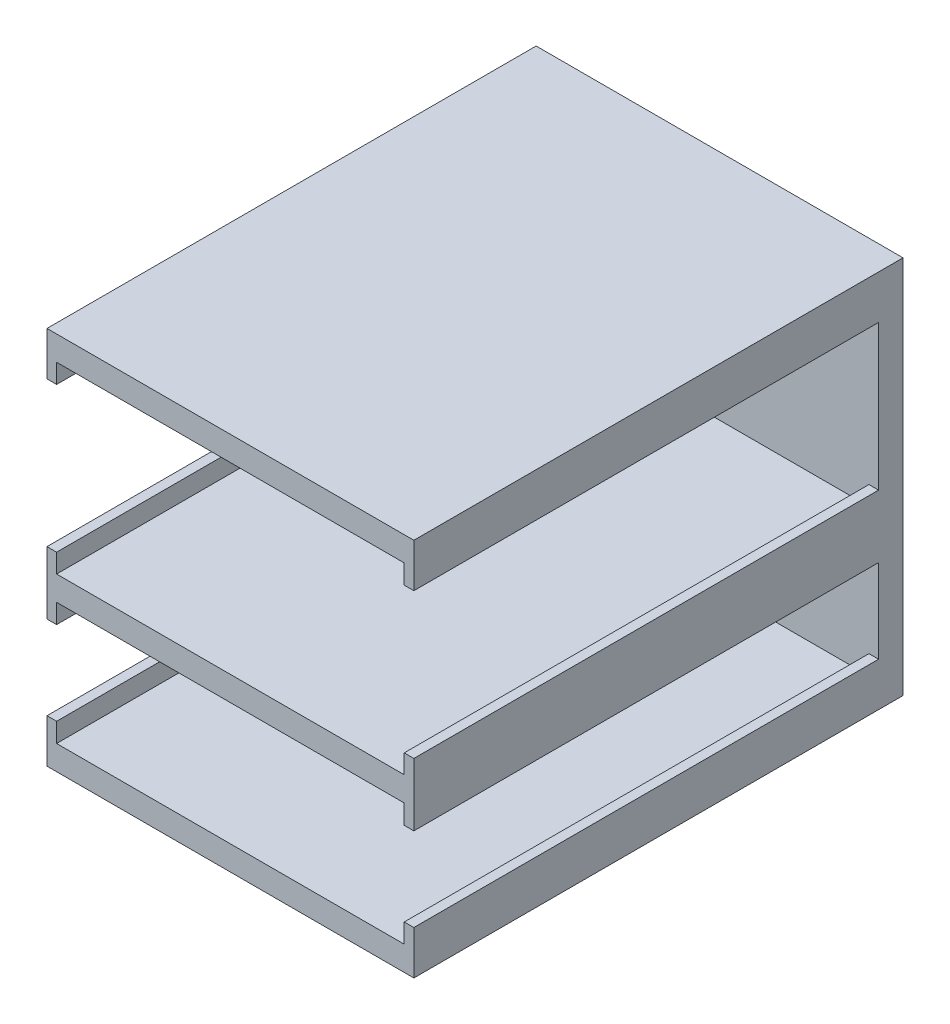
ISO-10303-21;
HEADER;
FILE_DESCRIPTION(('STEP AP214'),'2;1');
FILE_NAME('part.step','',(''),(''),'','','');
FILE_SCHEMA(('AUTOMOTIVE_DESIGN { 1 0 10303 214 1 1 1 1 }'));
ENDSEC;
DATA;
#1=APPLICATION_CONTEXT('core data for automotive mechanical design processes');
#2=APPLICATION_PROTOCOL_DEFINITION('international standard','automotive_design',2000,#1);
#3=PRODUCT_CONTEXT('',#1,'mechanical');
#4=PRODUCT('Part','Part','',(#3));
#5=PRODUCT_RELATED_PRODUCT_CATEGORY('part','',(#4));
#6=PRODUCT_DEFINITION_FORMATION('','',#4);
#7=PRODUCT_DEFINITION_CONTEXT('part definition',#1,'design');
#8=PRODUCT_DEFINITION('design','',#6,#7);
#9=PRODUCT_DEFINITION_SHAPE('','',#8);
#10=(LENGTH_UNIT() NAMED_UNIT(*) SI_UNIT(.MILLI.,.METRE.));
#11=(NAMED_UNIT(*) PLANE_ANGLE_UNIT() SI_UNIT($,.RADIAN.));
#12=(NAMED_UNIT(*) SI_UNIT($,.STERADIAN.) SOLID_ANGLE_UNIT());
#13=UNCERTAINTY_MEASURE_WITH_UNIT(LENGTH_MEASURE(1.E-05),#10,'distance_accuracy_value','');
#14=(GEOMETRIC_REPRESENTATION_CONTEXT(3) GLOBAL_UNCERTAINTY_ASSIGNED_CONTEXT((#13)) GLOBAL_UNIT_ASSIGNED_CONTEXT((#10,
#11,#12)) REPRESENTATION_CONTEXT('',''));
#15=CARTESIAN_POINT('',(0.,0.,0.));
#16=DIRECTION('',(0.,0.,1.));
#17=DIRECTION('',(1.,0.,0.));
#18=AXIS2_PLACEMENT_3D('',#15,#16,#17);
#19=CARTESIAN_POINT('',(38.1,78.74,50.8));
#20=DIRECTION('',(0.,0.,-1.));
#21=DIRECTION('',(-1.,0.,0.));
#22=AXIS2_PLACEMENT_3D('',#19,#20,#21);
#23=PLANE('',#22);
#24=DIRECTION('',(1.,0.,0.));
#25=VECTOR('',#24,1.);
#26=CARTESIAN_POINT('',(34.1,69.66,50.8));
#27=LINE('',#26,#25);
#28=CARTESIAN_POINT('',(36.1,69.66,50.8));
#29=VERTEX_POINT('',#28);
#30=CARTESIAN_POINT('',(38.1,69.66,50.8));
#31=VERTEX_POINT('',#30);
#32=EDGE_CURVE('E374',#29,#31,#27,.T.);
#33=ORIENTED_EDGE('',*,*,#32,.T.);
#34=DIRECTION('',(0.,-1.,0.));
#35=VECTOR('',#34,1.);
#36=CARTESIAN_POINT('',(38.1,78.74,50.8));
#37=LINE('',#36,#35);
#38=CARTESIAN_POINT('',(38.1,78.74,50.8));
#39=VERTEX_POINT('',#38);
#40=EDGE_CURVE('E257',#39,#31,#37,.T.);
#41=ORIENTED_EDGE('',*,*,#40,.F.);
#42=DIRECTION('',(1.,0.,0.));
#43=VECTOR('',#42,1.);
#44=CARTESIAN_POINT('',(38.1,78.74,50.8));
#45=LINE('',#44,#43);
#46=CARTESIAN_POINT('',(-38.1,78.74,50.8));
#47=VERTEX_POINT('',#46);
#48=EDGE_CURVE('E392',#47,#39,#45,.T.);
#49=ORIENTED_EDGE('',*,*,#48,.F.);
#50=DIRECTION('',(0.,-1.,0.));
#51=VECTOR('',#50,1.);
#52=CARTESIAN_POINT('',(-38.1,78.74,50.8));
#53=LINE('',#52,#51);
#54=CARTESIAN_POINT('',(-38.1,69.66,50.8));
#55=VERTEX_POINT('',#54);
#56=EDGE_CURVE('E268',#47,#55,#53,.T.);
#57=ORIENTED_EDGE('',*,*,#56,.T.);
#58=DIRECTION('',(-1.,0.,0.));
#59=VECTOR('',#58,1.);
#60=CARTESIAN_POINT('',(-34.1,69.66,50.8));
#61=LINE('',#60,#59);
#62=CARTESIAN_POINT('',(-36.1,69.66,50.8));
#63=VERTEX_POINT('',#62);
#64=EDGE_CURVE('E473',#63,#55,#61,.T.);
#65=ORIENTED_EDGE('',*,*,#64,.F.);
#66=DIRECTION('',(0.,-1.,0.));
#67=VECTOR('',#66,1.);
#68=CARTESIAN_POINT('',(-36.1,78.74,50.8));
#69=LINE('',#68,#67);
#70=CARTESIAN_POINT('',(-36.1,73.66,50.8));
#71=VERTEX_POINT('',#70);
#72=EDGE_CURVE('E500',#71,#63,#69,.T.);
#73=ORIENTED_EDGE('',*,*,#72,.F.);
#74=DIRECTION('',(-1.,0.,0.));
#75=VECTOR('',#74,1.);
#76=CARTESIAN_POINT('',(-38.1,73.66,50.8));
#77=LINE('',#76,#75);
#78=CARTESIAN_POINT('',(36.1,73.66,50.8));
#79=VERTEX_POINT('',#78);
#80=EDGE_CURVE('E517',#79,#71,#77,.T.);
#81=ORIENTED_EDGE('',*,*,#80,.F.);
#82=DIRECTION('',(0.,-1.,0.));
#83=VECTOR('',#82,1.);
#84=CARTESIAN_POINT('',(36.1,78.74,50.8));
#85=LINE('',#84,#83);
#86=EDGE_CURVE('E326',#79,#29,#85,.T.);
#87=ORIENTED_EDGE('',*,*,#86,.T.);
#88=EDGE_LOOP('',(#33,#41,#49,#57,#65,#73,#81,#87));
#89=FACE_BOUND('',#88,.T.);
#90=ADVANCED_FACE('F47',(#89),#23,.F.);
#91=DIRECTION('',(1.,0.,0.));
#92=VECTOR('',#91,1.);
#93=CARTESIAN_POINT('',(34.1,39.4956929003993,50.8));
#94=LINE('',#93,#92);
#95=CARTESIAN_POINT('',(36.1,39.4956929003993,50.8));
#96=VERTEX_POINT('',#95);
#97=CARTESIAN_POINT('',(38.1,39.4956929003993,50.8));
#98=VERTEX_POINT('',#97);
#99=EDGE_CURVE('E231',#96,#98,#94,.T.);
#100=ORIENTED_EDGE('',*,*,#99,.F.);
#101=CARTESIAN_POINT('',(36.1,35.56,50.8));
#102=VERTEX_POINT('',#101);
#103=EDGE_CURVE('E307',#96,#102,#85,.T.);
#104=ORIENTED_EDGE('',*,*,#103,.T.);
#105=DIRECTION('',(1.,0.,0.));
#106=VECTOR('',#105,1.);
#107=CARTESIAN_POINT('',(-38.1,35.56,50.8));
#108=LINE('',#107,#106);
#109=CARTESIAN_POINT('',(-36.1,35.56,50.8));
#110=VERTEX_POINT('',#109);
#111=EDGE_CURVE('E513',#110,#102,#108,.T.);
#112=ORIENTED_EDGE('',*,*,#111,.F.);
#113=CARTESIAN_POINT('',(-36.1,39.4956929003993,50.8));
#114=VERTEX_POINT('',#113);
#115=EDGE_CURVE('E499',#114,#110,#69,.T.);
#116=ORIENTED_EDGE('',*,*,#115,.F.);
#117=DIRECTION('',(-1.,0.,0.));
#118=VECTOR('',#117,1.);
#119=CARTESIAN_POINT('',(-34.1,39.4956929003993,50.8));
#120=LINE('',#119,#118);
#121=CARTESIAN_POINT('',(-38.1,39.4956929003993,50.8));
#122=VERTEX_POINT('',#121);
#123=EDGE_CURVE('E453',#114,#122,#120,.T.);
#124=ORIENTED_EDGE('',*,*,#123,.T.);
#125=CARTESIAN_POINT('',(-38.1,26.4594240145697,50.8));
#126=VERTEX_POINT('',#125);
#127=EDGE_CURVE('E273',#122,#126,#53,.T.);
#128=ORIENTED_EDGE('',*,*,#127,.T.);
#129=DIRECTION('',(-1.,0.,0.));
#130=VECTOR('',#129,1.);
#131=CARTESIAN_POINT('',(-34.1,26.4594240145697,50.8));
#132=LINE('',#131,#130);
#133=CARTESIAN_POINT('',(-36.1,26.4594240145697,50.8));
#134=VERTEX_POINT('',#133);
#135=EDGE_CURVE('E450',#134,#126,#132,.T.);
#136=ORIENTED_EDGE('',*,*,#135,.F.);
#137=CARTESIAN_POINT('',(-36.1,30.48,50.8));
#138=VERTEX_POINT('',#137);
#139=EDGE_CURVE('E496',#138,#134,#69,.T.);
#140=ORIENTED_EDGE('',*,*,#139,.F.);
#141=DIRECTION('',(-1.,0.,0.));
#142=VECTOR('',#141,1.);
#143=CARTESIAN_POINT('',(-38.1,30.48,50.8));
#144=LINE('',#143,#142);
#145=CARTESIAN_POINT('',(36.1,30.48,50.8));
#146=VERTEX_POINT('',#145);
#147=EDGE_CURVE('E529',#146,#138,#144,.T.);
#148=ORIENTED_EDGE('',*,*,#147,.F.);
#149=CARTESIAN_POINT('',(36.1,26.4594240145697,50.8));
#150=VERTEX_POINT('',#149);
#151=EDGE_CURVE('E333',#146,#150,#85,.T.);
#152=ORIENTED_EDGE('',*,*,#151,.T.);
#153=DIRECTION('',(1.,0.,0.));
#154=VECTOR('',#153,1.);
#155=CARTESIAN_POINT('',(34.1,26.4594240145697,50.8));
#156=LINE('',#155,#154);
#157=CARTESIAN_POINT('',(38.1,26.4594240145697,50.8));
#158=VERTEX_POINT('',#157);
#159=EDGE_CURVE('E255',#150,#158,#156,.T.);
#160=ORIENTED_EDGE('',*,*,#159,.T.);
#161=EDGE_CURVE('E246',#98,#158,#37,.T.);
#162=ORIENTED_EDGE('',*,*,#161,.F.);
#163=EDGE_LOOP('',(#100,#104,#112,#116,#124,#128,#136,#140,#148,#152,#160,#162));
#164=FACE_BOUND('',#163,.T.);
#165=ADVANCED_FACE('F253',(#164),#23,.F.);
#166=CARTESIAN_POINT('',(38.1,78.74,50.8));
#167=DIRECTION('',(-1.,0.,0.));
#168=DIRECTION('',(0.,0.,1.));
#169=AXIS2_PLACEMENT_3D('',#166,#167,#168);
#170=PLANE('',#169);
#171=DIRECTION('',(0.,0.,-1.));
#172=VECTOR('',#171,1.);
#173=CARTESIAN_POINT('',(38.1,69.66,-44.7633760845463));
#174=LINE('',#173,#172);
#175=CARTESIAN_POINT('',(38.1,69.66,-45.72));
#176=VERTEX_POINT('',#175);
#177=EDGE_CURVE('E240',#31,#176,#174,.T.);
#178=ORIENTED_EDGE('',*,*,#177,.T.);
#179=DIRECTION('',(0.,-1.,0.));
#180=VECTOR('',#179,1.);
#181=CARTESIAN_POINT('',(38.1,69.66,-45.72));
#182=LINE('',#181,#180);
#183=CARTESIAN_POINT('',(38.1,39.4956929003993,-45.72));
#184=VERTEX_POINT('',#183);
#185=EDGE_CURVE('E249',#176,#184,#182,.T.);
#186=ORIENTED_EDGE('',*,*,#185,.T.);
#187=DIRECTION('',(0.,0.,1.));
#188=VECTOR('',#187,1.);
#189=CARTESIAN_POINT('',(38.1,39.4956929003993,-45.72));
#190=LINE('',#189,#188);
#191=EDGE_CURVE('E234',#184,#98,#190,.T.);
#192=ORIENTED_EDGE('',*,*,#191,.T.);
#193=ORIENTED_EDGE('',*,*,#161,.T.);
#194=DIRECTION('',(0.,0.,-1.));
#195=VECTOR('',#194,1.);
#196=CARTESIAN_POINT('',(38.1,26.4594240145697,50.8));
#197=LINE('',#196,#195);
#198=CARTESIAN_POINT('',(38.1,26.4594240145697,-45.72));
#199=VERTEX_POINT('',#198);
#200=EDGE_CURVE('E360',#158,#199,#197,.T.);
#201=ORIENTED_EDGE('',*,*,#200,.T.);
#202=DIRECTION('',(0.,-1.,0.));
#203=VECTOR('',#202,1.);
#204=CARTESIAN_POINT('',(38.1,26.4594240145697,-45.72));
#205=LINE('',#204,#203);
#206=CARTESIAN_POINT('',(38.1,9.08,-45.72));
#207=VERTEX_POINT('',#206);
#208=EDGE_CURVE('E367',#199,#207,#205,.T.);
#209=ORIENTED_EDGE('',*,*,#208,.T.);
#210=DIRECTION('',(0.,0.,1.));
#211=VECTOR('',#210,1.);
#212=CARTESIAN_POINT('',(38.1,9.08,50.8));
#213=LINE('',#212,#211);
#214=CARTESIAN_POINT('',(38.1,9.08,50.8));
#215=VERTEX_POINT('',#214);
#216=EDGE_CURVE('E371',#207,#215,#213,.T.);
#217=ORIENTED_EDGE('',*,*,#216,.T.);
#218=CARTESIAN_POINT('',(38.1,0.,50.8));
#219=VERTEX_POINT('',#218);
#220=EDGE_CURVE('E258',#215,#219,#37,.T.);
#221=ORIENTED_EDGE('',*,*,#220,.T.);
#222=DIRECTION('',(0.,0.,-1.));
#223=VECTOR('',#222,1.);
#224=CARTESIAN_POINT('',(38.1,0.,50.8));
#225=LINE('',#224,#223);
#226=CARTESIAN_POINT('',(38.1,0.,-50.8));
#227=VERTEX_POINT('',#226);
#228=EDGE_CURVE('E419',#219,#227,#225,.T.);
#229=ORIENTED_EDGE('',*,*,#228,.T.);
#230=DIRECTION('',(0.,-1.,0.));
#231=VECTOR('',#230,1.);
#232=CARTESIAN_POINT('',(38.1,78.74,-50.8));
#233=LINE('',#232,#231);
#234=CARTESIAN_POINT('',(38.1,78.74,-50.8));
#235=VERTEX_POINT('',#234);
#236=EDGE_CURVE('E264',#235,#227,#233,.T.);
#237=ORIENTED_EDGE('',*,*,#236,.F.);
#238=DIRECTION('',(0.,0.,-1.));
#239=VECTOR('',#238,1.);
#240=CARTESIAN_POINT('',(38.1,78.74,50.8));
#241=LINE('',#240,#239);
#242=EDGE_CURVE('E395',#39,#235,#241,.T.);
#243=ORIENTED_EDGE('',*,*,#242,.F.);
#244=ORIENTED_EDGE('',*,*,#40,.T.);
#245=EDGE_LOOP('',(#178,#186,#192,#193,#201,#209,#217,#221,#229,#237,#243,#244));
#246=FACE_BOUND('',#245,.T.);
#247=ADVANCED_FACE('F244',(#246),#170,.F.);
#248=CARTESIAN_POINT('',(36.1,78.74,50.8));
#249=DIRECTION('',(-1.,0.,0.));
#250=DIRECTION('',(0.,0.,1.));
#251=AXIS2_PLACEMENT_3D('',#248,#249,#250);
#252=PLANE('',#251);
#253=DIRECTION('',(0.,-1.,0.));
#254=VECTOR('',#253,1.);
#255=CARTESIAN_POINT('',(36.1,78.74,-45.72));
#256=LINE('',#255,#254);
#257=CARTESIAN_POINT('',(36.1,73.66,-45.72));
#258=VERTEX_POINT('',#257);
#259=CARTESIAN_POINT('',(36.1,69.66,-45.72));
#260=VERTEX_POINT('',#259);
#261=EDGE_CURVE('E314',#258,#260,#256,.T.);
#262=ORIENTED_EDGE('',*,*,#261,.T.);
#263=DIRECTION('',(0.,0.,1.));
#264=VECTOR('',#263,1.);
#265=CARTESIAN_POINT('',(36.1,69.66,50.8));
#266=LINE('',#265,#264);
#267=EDGE_CURVE('E11',#260,#29,#266,.T.);
#268=ORIENTED_EDGE('',*,*,#267,.T.);
#269=ORIENTED_EDGE('',*,*,#86,.F.);
#270=DIRECTION('',(0.,0.,1.));
#271=VECTOR('',#270,1.);
#272=CARTESIAN_POINT('',(36.1,73.66,-45.72));
#273=LINE('',#272,#271);
#274=EDGE_CURVE('E862',#258,#79,#273,.T.);
#275=ORIENTED_EDGE('',*,*,#274,.F.);
#276=EDGE_LOOP('',(#262,#268,#269,#275));
#277=FACE_BOUND('',#276,.T.);
#278=ADVANCED_FACE('F573',(#277),#252,.T.);
#279=ORIENTED_EDGE('',*,*,#103,.F.);
#280=DIRECTION('',(0.,0.,-1.));
#281=VECTOR('',#280,1.);
#282=CARTESIAN_POINT('',(36.1,39.4956929003993,50.8));
#283=LINE('',#282,#281);
#284=CARTESIAN_POINT('',(36.1,39.4956929003993,-45.72));
#285=VERTEX_POINT('',#284);
#286=EDGE_CURVE('E56',#96,#285,#283,.T.);
#287=ORIENTED_EDGE('',*,*,#286,.T.);
#288=CARTESIAN_POINT('',(36.1,35.56,-45.72));
#289=VERTEX_POINT('',#288);
#290=EDGE_CURVE('E305',#285,#289,#256,.T.);
#291=ORIENTED_EDGE('',*,*,#290,.T.);
#292=DIRECTION('',(0.,0.,-1.));
#293=VECTOR('',#292,1.);
#294=CARTESIAN_POINT('',(36.1,35.56,-45.72));
#295=LINE('',#294,#293);
#296=EDGE_CURVE('E321',#102,#289,#295,.T.);
#297=ORIENTED_EDGE('',*,*,#296,.F.);
#298=EDGE_LOOP('',(#279,#287,#291,#297));
#299=FACE_BOUND('',#298,.T.);
#300=ADVANCED_FACE('F303',(#299),#252,.T.);
#301=DIRECTION('',(1.,0.,0.));
#302=VECTOR('',#301,1.);
#303=CARTESIAN_POINT('',(34.1,9.08,50.8));
#304=LINE('',#303,#302);
#305=CARTESIAN_POINT('',(36.1,9.08,50.8));
#306=VERTEX_POINT('',#305);
#307=EDGE_CURVE('E357',#306,#215,#304,.T.);
#308=ORIENTED_EDGE('',*,*,#307,.F.);
#309=CARTESIAN_POINT('',(36.1,5.08,50.8));
#310=VERTEX_POINT('',#309);
#311=EDGE_CURVE('E334',#306,#310,#85,.T.);
#312=ORIENTED_EDGE('',*,*,#311,.T.);
#313=DIRECTION('',(1.,0.,0.));
#314=VECTOR('',#313,1.);
#315=CARTESIAN_POINT('',(-38.1,5.08,50.8));
#316=LINE('',#315,#314);
#317=CARTESIAN_POINT('',(-36.1,5.08,50.8));
#318=VERTEX_POINT('',#317);
#319=EDGE_CURVE('E520',#318,#310,#316,.T.);
#320=ORIENTED_EDGE('',*,*,#319,.F.);
#321=CARTESIAN_POINT('',(-36.1,9.08,50.8));
#322=VERTEX_POINT('',#321);
#323=EDGE_CURVE('E495',#322,#318,#69,.T.);
#324=ORIENTED_EDGE('',*,*,#323,.F.);
#325=DIRECTION('',(-1.,0.,0.));
#326=VECTOR('',#325,1.);
#327=CARTESIAN_POINT('',(-34.1,9.08,50.8));
#328=LINE('',#327,#326);
#329=CARTESIAN_POINT('',(-38.1,9.08,50.8));
#330=VERTEX_POINT('',#329);
#331=EDGE_CURVE('E478',#322,#330,#328,.T.);
#332=ORIENTED_EDGE('',*,*,#331,.T.);
#333=CARTESIAN_POINT('',(-38.1,0.,50.8));
#334=VERTEX_POINT('',#333);
#335=EDGE_CURVE('E263',#330,#334,#53,.T.);
#336=ORIENTED_EDGE('',*,*,#335,.T.);
#337=DIRECTION('',(1.,0.,0.));
#338=VECTOR('',#337,1.);
#339=CARTESIAN_POINT('',(38.1,0.,50.8));
#340=LINE('',#339,#338);
#341=EDGE_CURVE('E414',#334,#219,#340,.T.);
#342=ORIENTED_EDGE('',*,*,#341,.T.);
#343=ORIENTED_EDGE('',*,*,#220,.F.);
#344=EDGE_LOOP('',(#308,#312,#320,#324,#332,#336,#342,#343));
#345=FACE_BOUND('',#344,.T.);
#346=ADVANCED_FACE('F562',(#345),#23,.F.);
#347=CARTESIAN_POINT('',(36.1,30.48,-45.72));
#348=VERTEX_POINT('',#347);
#349=CARTESIAN_POINT('',(36.1,26.4594240145697,-45.72));
#350=VERTEX_POINT('',#349);
#351=EDGE_CURVE('E315',#348,#350,#256,.T.);
#352=ORIENTED_EDGE('',*,*,#351,.T.);
#353=DIRECTION('',(0.,0.,1.));
#354=VECTOR('',#353,1.);
#355=CARTESIAN_POINT('',(36.1,26.4594240145697,50.8));
#356=LINE('',#355,#354);
#357=EDGE_CURVE('E297',#350,#150,#356,.T.);
#358=ORIENTED_EDGE('',*,*,#357,.T.);
#359=ORIENTED_EDGE('',*,*,#151,.F.);
#360=DIRECTION('',(0.,0.,1.));
#361=VECTOR('',#360,1.);
#362=CARTESIAN_POINT('',(36.1,30.48,-45.72));
#363=LINE('',#362,#361);
#364=EDGE_CURVE('E864',#348,#146,#363,.T.);
#365=ORIENTED_EDGE('',*,*,#364,.F.);
#366=EDGE_LOOP('',(#352,#358,#359,#365));
#367=FACE_BOUND('',#366,.T.);
#368=ADVANCED_FACE('F565',(#367),#252,.T.);
#369=ORIENTED_EDGE('',*,*,#311,.F.);
#370=DIRECTION('',(0.,0.,-1.));
#371=VECTOR('',#370,1.);
#372=CARTESIAN_POINT('',(36.1,9.08000000000001,50.8));
#373=LINE('',#372,#371);
#374=CARTESIAN_POINT('',(36.1,9.08000000000001,-45.72));
#375=VERTEX_POINT('',#374);
#376=EDGE_CURVE('E294',#306,#375,#373,.T.);
#377=ORIENTED_EDGE('',*,*,#376,.T.);
#378=CARTESIAN_POINT('',(36.1,5.08,-45.72));
#379=VERTEX_POINT('',#378);
#380=EDGE_CURVE('E317',#375,#379,#256,.T.);
#381=ORIENTED_EDGE('',*,*,#380,.T.);
#382=DIRECTION('',(0.,0.,-1.));
#383=VECTOR('',#382,1.);
#384=CARTESIAN_POINT('',(36.1,5.08,50.8));
#385=LINE('',#384,#383);
#386=EDGE_CURVE('E343',#310,#379,#385,.T.);
#387=ORIENTED_EDGE('',*,*,#386,.F.);
#388=EDGE_LOOP('',(#369,#377,#381,#387));
#389=FACE_BOUND('',#388,.T.);
#390=ADVANCED_FACE('F570',(#389),#252,.T.);
#391=CARTESIAN_POINT('',(-36.1,78.74,50.8));
#392=DIRECTION('',(-1.,0.,0.));
#393=DIRECTION('',(0.,0.,1.));
#394=AXIS2_PLACEMENT_3D('',#391,#392,#393);
#395=PLANE('',#394);
#396=DIRECTION('',(0.,1.,0.));
#397=VECTOR('',#396,1.);
#398=CARTESIAN_POINT('',(-36.1,0.,-45.72));
#399=LINE('',#398,#397);
#400=CARTESIAN_POINT('',(-36.1,35.56,-45.72));
#401=VERTEX_POINT('',#400);
#402=CARTESIAN_POINT('',(-36.1,39.4956929003993,-45.72));
#403=VERTEX_POINT('',#402);
#404=EDGE_CURVE('E274',#401,#403,#399,.T.);
#405=ORIENTED_EDGE('',*,*,#404,.T.);
#406=DIRECTION('',(0.,0.,1.));
#407=VECTOR('',#406,1.);
#408=CARTESIAN_POINT('',(-36.1,39.4956929003993,50.8));
#409=LINE('',#408,#407);
#410=EDGE_CURVE('E290',#403,#114,#409,.T.);
#411=ORIENTED_EDGE('',*,*,#410,.T.);
#412=ORIENTED_EDGE('',*,*,#115,.T.);
#413=DIRECTION('',(0.,0.,-1.));
#414=VECTOR('',#413,1.);
#415=CARTESIAN_POINT('',(-36.1,35.56,-45.72));
#416=LINE('',#415,#414);
#417=EDGE_CURVE('E501',#110,#401,#416,.T.);
#418=ORIENTED_EDGE('',*,*,#417,.T.);
#419=EDGE_LOOP('',(#405,#411,#412,#418));
#420=FACE_BOUND('',#419,.T.);
#421=ADVANCED_FACE('F616',(#420),#395,.F.);
#422=DIRECTION('',(0.,-1.,0.));
#423=VECTOR('',#422,1.);
#424=CARTESIAN_POINT('',(-36.1,78.74,-45.72));
#425=LINE('',#424,#423);
#426=CARTESIAN_POINT('',(-36.1,9.08,-45.72));
#427=VERTEX_POINT('',#426);
#428=CARTESIAN_POINT('',(-36.1,5.08,-45.72));
#429=VERTEX_POINT('',#428);
#430=EDGE_CURVE('E490',#427,#429,#425,.T.);
#431=ORIENTED_EDGE('',*,*,#430,.F.);
#432=DIRECTION('',(0.,0.,1.));
#433=VECTOR('',#432,1.);
#434=CARTESIAN_POINT('',(-36.1,9.08000000000001,50.8));
#435=LINE('',#434,#433);
#436=EDGE_CURVE('E282',#427,#322,#435,.T.);
#437=ORIENTED_EDGE('',*,*,#436,.T.);
#438=ORIENTED_EDGE('',*,*,#323,.T.);
#439=DIRECTION('',(0.,0.,-1.));
#440=VECTOR('',#439,1.);
#441=CARTESIAN_POINT('',(-36.1,5.08,50.8));
#442=LINE('',#441,#440);
#443=EDGE_CURVE('E481',#318,#429,#442,.T.);
#444=ORIENTED_EDGE('',*,*,#443,.T.);
#445=EDGE_LOOP('',(#431,#437,#438,#444));
#446=FACE_BOUND('',#445,.T.);
#447=ADVANCED_FACE('F560',(#446),#395,.F.);
#448=CARTESIAN_POINT('',(-38.1,30.48,-45.72));
#449=DIRECTION('',(0.,1.,0.));
#450=DIRECTION('',(0.,0.,1.));
#451=AXIS2_PLACEMENT_3D('',#448,#449,#450);
#452=PLANE('',#451);
#453=DIRECTION('',(-1.,0.,0.));
#454=VECTOR('',#453,1.);
#455=CARTESIAN_POINT('',(-38.1,30.48,-45.72));
#456=LINE('',#455,#454);
#457=CARTESIAN_POINT('',(-36.1,30.48,-45.72));
#458=VERTEX_POINT('',#457);
#459=EDGE_CURVE('E415',#348,#458,#456,.T.);
#460=ORIENTED_EDGE('',*,*,#459,.F.);
#461=ORIENTED_EDGE('',*,*,#364,.T.);
#462=ORIENTED_EDGE('',*,*,#147,.T.);
#463=DIRECTION('',(0.,0.,1.));
#464=VECTOR('',#463,1.);
#465=CARTESIAN_POINT('',(-36.1,30.48,-45.72));
#466=LINE('',#465,#464);
#467=EDGE_CURVE('E509',#458,#138,#466,.T.);
#468=ORIENTED_EDGE('',*,*,#467,.F.);
#469=EDGE_LOOP('',(#460,#461,#462,#468));
#470=FACE_BOUND('',#469,.T.);
#471=ADVANCED_FACE('F594',(#470),#452,.F.);
#472=CARTESIAN_POINT('',(-38.1,5.08,-45.72));
#473=DIRECTION('',(0.,-1.,0.));
#474=DIRECTION('',(0.,0.,-1.));
#475=AXIS2_PLACEMENT_3D('',#472,#473,#474);
#476=PLANE('',#475);
#477=ORIENTED_EDGE('',*,*,#319,.T.);
#478=ORIENTED_EDGE('',*,*,#386,.T.);
#479=DIRECTION('',(1.,0.,0.));
#480=VECTOR('',#479,1.);
#481=CARTESIAN_POINT('',(-38.1,5.08,-45.72));
#482=LINE('',#481,#480);
#483=EDGE_CURVE('E526',#429,#379,#482,.T.);
#484=ORIENTED_EDGE('',*,*,#483,.F.);
#485=ORIENTED_EDGE('',*,*,#443,.F.);
#486=EDGE_LOOP('',(#477,#478,#484,#485));
#487=FACE_BOUND('',#486,.T.);
#488=ADVANCED_FACE('F561',(#487),#476,.F.);
#489=CARTESIAN_POINT('',(0.,0.,-45.72));
#490=DIRECTION('',(0.,0.,-1.));
#491=DIRECTION('',(-1.,0.,0.));
#492=AXIS2_PLACEMENT_3D('',#489,#490,#491);
#493=PLANE('',#492);
#494=ORIENTED_EDGE('',*,*,#380,.F.);
#495=DIRECTION('',(1.,0.,0.));
#496=VECTOR('',#495,1.);
#497=CARTESIAN_POINT('',(34.1,9.08,-45.72));
#498=LINE('',#497,#496);
#499=EDGE_CURVE('E71',#375,#207,#498,.T.);
#500=ORIENTED_EDGE('',*,*,#499,.T.);
#501=ORIENTED_EDGE('',*,*,#208,.F.);
#502=DIRECTION('',(1.,0.,0.));
#503=VECTOR('',#502,1.);
#504=CARTESIAN_POINT('',(34.1,26.4594240145697,-45.72));
#505=LINE('',#504,#503);
#506=EDGE_CURVE('E354',#350,#199,#505,.T.);
#507=ORIENTED_EDGE('',*,*,#506,.F.);
#508=ORIENTED_EDGE('',*,*,#351,.F.);
#509=ORIENTED_EDGE('',*,*,#459,.T.);
#510=CARTESIAN_POINT('',(-36.1,26.4594240145697,-45.72));
#511=VERTEX_POINT('',#510);
#512=EDGE_CURVE('E491',#458,#511,#425,.T.);
#513=ORIENTED_EDGE('',*,*,#512,.T.);
#514=DIRECTION('',(-1.,0.,0.));
#515=VECTOR('',#514,1.);
#516=CARTESIAN_POINT('',(-34.1,26.4594240145697,-45.72));
#517=LINE('',#516,#515);
#518=CARTESIAN_POINT('',(-38.1,26.4594240145697,-45.72));
#519=VERTEX_POINT('',#518);
#520=EDGE_CURVE('E461',#511,#519,#517,.T.);
#521=ORIENTED_EDGE('',*,*,#520,.T.);
#522=DIRECTION('',(0.,-1.,0.));
#523=VECTOR('',#522,1.);
#524=CARTESIAN_POINT('',(-38.1,26.4594240145697,-45.72));
#525=LINE('',#524,#523);
#526=CARTESIAN_POINT('',(-38.1,9.08,-45.72));
#527=VERTEX_POINT('',#526);
#528=EDGE_CURVE('E464',#519,#527,#525,.T.);
#529=ORIENTED_EDGE('',*,*,#528,.T.);
#530=DIRECTION('',(-1.,0.,0.));
#531=VECTOR('',#530,1.);
#532=CARTESIAN_POINT('',(-34.1,9.08,-45.72));
#533=LINE('',#532,#531);
#534=EDGE_CURVE('E482',#427,#527,#533,.T.);
#535=ORIENTED_EDGE('',*,*,#534,.F.);
#536=ORIENTED_EDGE('',*,*,#430,.T.);
#537=ORIENTED_EDGE('',*,*,#483,.T.);
#538=EDGE_LOOP('',(#494,#500,#501,#507,#508,#509,#513,#521,#529,#535,#536,#537));
#539=FACE_BOUND('',#538,.T.);
#540=ADVANCED_FACE('F593',(#539),#493,.F.);
#541=CARTESIAN_POINT('',(-38.1,73.66,-45.72));
#542=DIRECTION('',(0.,1.,0.));
#543=DIRECTION('',(0.,0.,1.));
#544=AXIS2_PLACEMENT_3D('',#541,#542,#543);
#545=PLANE('',#544);
#546=DIRECTION('',(-1.,0.,0.));
#547=VECTOR('',#546,1.);
#548=CARTESIAN_POINT('',(-38.1,73.66,-45.72));
#549=LINE('',#548,#547);
#550=CARTESIAN_POINT('',(-36.1,73.66,-45.72));
#551=VERTEX_POINT('',#550);
#552=EDGE_CURVE('E516',#258,#551,#549,.T.);
#553=ORIENTED_EDGE('',*,*,#552,.F.);
#554=ORIENTED_EDGE('',*,*,#274,.T.);
#555=ORIENTED_EDGE('',*,*,#80,.T.);
#556=DIRECTION('',(0.,0.,1.));
#557=VECTOR('',#556,1.);
#558=CARTESIAN_POINT('',(-36.1,73.66,-45.72));
#559=LINE('',#558,#557);
#560=EDGE_CURVE('E505',#551,#71,#559,.T.);
#561=ORIENTED_EDGE('',*,*,#560,.F.);
#562=EDGE_LOOP('',(#553,#554,#555,#561));
#563=FACE_BOUND('',#562,.T.);
#564=ADVANCED_FACE('F600',(#563),#545,.F.);
#565=CARTESIAN_POINT('',(-38.1,35.56,-45.72));
#566=DIRECTION('',(0.,-1.,0.));
#567=DIRECTION('',(0.,0.,-1.));
#568=AXIS2_PLACEMENT_3D('',#565,#566,#567);
#569=PLANE('',#568);
#570=ORIENTED_EDGE('',*,*,#111,.T.);
#571=ORIENTED_EDGE('',*,*,#296,.T.);
#572=DIRECTION('',(1.,0.,0.));
#573=VECTOR('',#572,1.);
#574=CARTESIAN_POINT('',(-38.1,35.56,-45.72));
#575=LINE('',#574,#573);
#576=EDGE_CURVE('E312',#401,#289,#575,.T.);
#577=ORIENTED_EDGE('',*,*,#576,.F.);
#578=ORIENTED_EDGE('',*,*,#417,.F.);
#579=EDGE_LOOP('',(#570,#571,#577,#578));
#580=FACE_BOUND('',#579,.T.);
#581=ADVANCED_FACE('F602',(#580),#569,.F.);
#582=CARTESIAN_POINT('',(0.,0.,-45.72));
#583=DIRECTION('',(0.,0.,-1.));
#584=DIRECTION('',(-1.,0.,0.));
#585=AXIS2_PLACEMENT_3D('',#582,#583,#584);
#586=PLANE('',#585);
#587=ORIENTED_EDGE('',*,*,#290,.F.);
#588=DIRECTION('',(1.,0.,0.));
#589=VECTOR('',#588,1.);
#590=CARTESIAN_POINT('',(34.1,39.4956929003993,-45.72));
#591=LINE('',#590,#589);
#592=EDGE_CURVE('E63',#285,#184,#591,.T.);
#593=ORIENTED_EDGE('',*,*,#592,.T.);
#594=ORIENTED_EDGE('',*,*,#185,.F.);
#595=DIRECTION('',(1.,0.,0.));
#596=VECTOR('',#595,1.);
#597=CARTESIAN_POINT('',(34.1,69.66,-45.72));
#598=LINE('',#597,#596);
#599=EDGE_CURVE('E378',#260,#176,#598,.T.);
#600=ORIENTED_EDGE('',*,*,#599,.F.);
#601=ORIENTED_EDGE('',*,*,#261,.F.);
#602=ORIENTED_EDGE('',*,*,#552,.T.);
#603=CARTESIAN_POINT('',(-36.1,69.66,-45.72));
#604=VERTEX_POINT('',#603);
#605=EDGE_CURVE('E272',#604,#551,#399,.T.);
#606=ORIENTED_EDGE('',*,*,#605,.F.);
#607=DIRECTION('',(-1.,0.,0.));
#608=VECTOR('',#607,1.);
#609=CARTESIAN_POINT('',(-34.1,69.66,-45.72));
#610=LINE('',#609,#608);
#611=CARTESIAN_POINT('',(-38.1,69.66,-45.72));
#612=VERTEX_POINT('',#611);
#613=EDGE_CURVE('E546',#604,#612,#610,.T.);
#614=ORIENTED_EDGE('',*,*,#613,.T.);
#615=DIRECTION('',(0.,-1.,0.));
#616=VECTOR('',#615,1.);
#617=CARTESIAN_POINT('',(-38.1,69.66,-45.72));
#618=LINE('',#617,#616);
#619=CARTESIAN_POINT('',(-38.1,39.4956929003993,-45.72));
#620=VERTEX_POINT('',#619);
#621=EDGE_CURVE('E872',#612,#620,#618,.T.);
#622=ORIENTED_EDGE('',*,*,#621,.T.);
#623=DIRECTION('',(-1.,0.,0.));
#624=VECTOR('',#623,1.);
#625=CARTESIAN_POINT('',(-34.1,39.4956929003993,-45.72));
#626=LINE('',#625,#624);
#627=EDGE_CURVE('E470',#403,#620,#626,.T.);
#628=ORIENTED_EDGE('',*,*,#627,.F.);
#629=ORIENTED_EDGE('',*,*,#404,.F.);
#630=ORIENTED_EDGE('',*,*,#576,.T.);
#631=EDGE_LOOP('',(#587,#593,#594,#600,#601,#602,#606,#614,#622,#628,#629,#630));
#632=FACE_BOUND('',#631,.T.);
#633=ADVANCED_FACE('F310',(#632),#586,.F.);
#634=CARTESIAN_POINT('',(-38.1,78.74,50.8));
#635=DIRECTION('',(1.,0.,0.));
#636=DIRECTION('',(0.,0.,-1.));
#637=AXIS2_PLACEMENT_3D('',#634,#635,#636);
#638=PLANE('',#637);
#639=ORIENTED_EDGE('',*,*,#127,.F.);
#640=DIRECTION('',(0.,0.,1.));
#641=VECTOR('',#640,1.);
#642=CARTESIAN_POINT('',(-38.1,39.4956929003993,50.8));
#643=LINE('',#642,#641);
#644=EDGE_CURVE('E547',#620,#122,#643,.T.);
#645=ORIENTED_EDGE('',*,*,#644,.F.);
#646=ORIENTED_EDGE('',*,*,#621,.F.);
#647=DIRECTION('',(0.,0.,-1.));
#648=VECTOR('',#647,1.);
#649=CARTESIAN_POINT('',(-38.1,69.66,-44.7633760845463));
#650=LINE('',#649,#648);
#651=EDGE_CURVE('E540',#55,#612,#650,.T.);
#652=ORIENTED_EDGE('',*,*,#651,.F.);
#653=ORIENTED_EDGE('',*,*,#56,.F.);
#654=DIRECTION('',(0.,0.,1.));
#655=VECTOR('',#654,1.);
#656=CARTESIAN_POINT('',(-38.1,78.74,50.8));
#657=LINE('',#656,#655);
#658=CARTESIAN_POINT('',(-38.1,78.74,-50.8));
#659=VERTEX_POINT('',#658);
#660=EDGE_CURVE('E406',#659,#47,#657,.T.);
#661=ORIENTED_EDGE('',*,*,#660,.F.);
#662=DIRECTION('',(0.,-1.,0.));
#663=VECTOR('',#662,1.);
#664=CARTESIAN_POINT('',(-38.1,78.74,-50.8));
#665=LINE('',#664,#663);
#666=CARTESIAN_POINT('',(-38.1,0.,-50.8));
#667=VERTEX_POINT('',#666);
#668=EDGE_CURVE('E404',#659,#667,#665,.T.);
#669=ORIENTED_EDGE('',*,*,#668,.T.);
#670=DIRECTION('',(0.,0.,1.));
#671=VECTOR('',#670,1.);
#672=CARTESIAN_POINT('',(-38.1,0.,50.8));
#673=LINE('',#672,#671);
#674=EDGE_CURVE('E410',#667,#334,#673,.T.);
#675=ORIENTED_EDGE('',*,*,#674,.T.);
#676=ORIENTED_EDGE('',*,*,#335,.F.);
#677=DIRECTION('',(0.,0.,1.));
#678=VECTOR('',#677,1.);
#679=CARTESIAN_POINT('',(-38.1,9.08,50.8));
#680=LINE('',#679,#678);
#681=EDGE_CURVE('E442',#527,#330,#680,.T.);
#682=ORIENTED_EDGE('',*,*,#681,.F.);
#683=ORIENTED_EDGE('',*,*,#528,.F.);
#684=DIRECTION('',(0.,0.,-1.));
#685=VECTOR('',#684,1.);
#686=CARTESIAN_POINT('',(-38.1,26.4594240145697,50.8));
#687=LINE('',#686,#685);
#688=EDGE_CURVE('E459',#126,#519,#687,.T.);
#689=ORIENTED_EDGE('',*,*,#688,.F.);
#690=EDGE_LOOP('',(#639,#645,#646,#652,#653,#661,#669,#675,#676,#682,#683,#689));
#691=FACE_BOUND('',#690,.T.);
#692=ADVANCED_FACE('F49',(#691),#638,.F.);
#693=CARTESIAN_POINT('',(38.1,78.74,-50.8));
#694=DIRECTION('',(0.,0.,1.));
#695=DIRECTION('',(1.,0.,0.));
#696=AXIS2_PLACEMENT_3D('',#693,#694,#695);
#697=PLANE('',#696);
#698=DIRECTION('',(-1.,0.,0.));
#699=VECTOR('',#698,1.);
#700=CARTESIAN_POINT('',(38.1,0.,-50.8));
#701=LINE('',#700,#699);
#702=EDGE_CURVE('E422',#227,#667,#701,.T.);
#703=ORIENTED_EDGE('',*,*,#702,.T.);
#704=ORIENTED_EDGE('',*,*,#668,.F.);
#705=DIRECTION('',(-1.,0.,0.));
#706=VECTOR('',#705,1.);
#707=CARTESIAN_POINT('',(38.1,78.74,-50.8));
#708=LINE('',#707,#706);
#709=EDGE_CURVE('E400',#235,#659,#708,.T.);
#710=ORIENTED_EDGE('',*,*,#709,.F.);
#711=ORIENTED_EDGE('',*,*,#236,.T.);
#712=EDGE_LOOP('',(#703,#704,#710,#711));
#713=FACE_BOUND('',#712,.T.);
#714=ADVANCED_FACE('F433',(#713),#697,.F.);
#715=CARTESIAN_POINT('',(0.,78.74,0.));
#716=DIRECTION('',(0.,1.,0.));
#717=DIRECTION('',(0.,0.,1.));
#718=AXIS2_PLACEMENT_3D('',#715,#716,#717);
#719=PLANE('',#718);
#720=ORIENTED_EDGE('',*,*,#242,.T.);
#721=ORIENTED_EDGE('',*,*,#709,.T.);
#722=ORIENTED_EDGE('',*,*,#660,.T.);
#723=ORIENTED_EDGE('',*,*,#48,.T.);
#724=EDGE_LOOP('',(#720,#721,#722,#723));
#725=FACE_BOUND('',#724,.T.);
#726=ADVANCED_FACE('F536',(#725),#719,.T.);
#727=CARTESIAN_POINT('',(0.,0.,0.));
#728=DIRECTION('',(0.,1.,0.));
#729=DIRECTION('',(0.,0.,1.));
#730=AXIS2_PLACEMENT_3D('',#727,#728,#729);
#731=PLANE('',#730);
#732=ORIENTED_EDGE('',*,*,#674,.F.);
#733=ORIENTED_EDGE('',*,*,#702,.F.);
#734=ORIENTED_EDGE('',*,*,#228,.F.);
#735=ORIENTED_EDGE('',*,*,#341,.F.);
#736=EDGE_LOOP('',(#732,#733,#734,#735));
#737=FACE_BOUND('',#736,.T.);
#738=ADVANCED_FACE('F436',(#737),#731,.F.);
#739=ORIENTED_EDGE('',*,*,#72,.T.);
#740=DIRECTION('',(0.,0.,-1.));
#741=VECTOR('',#740,1.);
#742=CARTESIAN_POINT('',(-36.1,69.66,50.8));
#743=LINE('',#742,#741);
#744=EDGE_CURVE('E286',#63,#604,#743,.T.);
#745=ORIENTED_EDGE('',*,*,#744,.T.);
#746=ORIENTED_EDGE('',*,*,#605,.T.);
#747=ORIENTED_EDGE('',*,*,#560,.T.);
#748=EDGE_LOOP('',(#739,#745,#746,#747));
#749=FACE_BOUND('',#748,.T.);
#750=ADVANCED_FACE('F549',(#749),#395,.F.);
#751=ORIENTED_EDGE('',*,*,#139,.T.);
#752=DIRECTION('',(0.,0.,-1.));
#753=VECTOR('',#752,1.);
#754=CARTESIAN_POINT('',(-36.1,26.4594240145697,50.8));
#755=LINE('',#754,#753);
#756=EDGE_CURVE('E278',#134,#511,#755,.T.);
#757=ORIENTED_EDGE('',*,*,#756,.T.);
#758=ORIENTED_EDGE('',*,*,#512,.F.);
#759=ORIENTED_EDGE('',*,*,#467,.T.);
#760=EDGE_LOOP('',(#751,#757,#758,#759));
#761=FACE_BOUND('',#760,.T.);
#762=ADVANCED_FACE('F611',(#761),#395,.F.);
#763=CARTESIAN_POINT('',(-34.1,9.08,50.8));
#764=DIRECTION('',(0.,-1.,0.));
#765=DIRECTION('',(0.,0.,-1.));
#766=AXIS2_PLACEMENT_3D('',#763,#764,#765);
#767=PLANE('',#766);
#768=ORIENTED_EDGE('',*,*,#534,.T.);
#769=ORIENTED_EDGE('',*,*,#681,.T.);
#770=ORIENTED_EDGE('',*,*,#331,.F.);
#771=ORIENTED_EDGE('',*,*,#436,.F.);
#772=EDGE_LOOP('',(#768,#769,#770,#771));
#773=FACE_BOUND('',#772,.T.);
#774=ADVANCED_FACE('F614',(#773),#767,.F.);
#775=CARTESIAN_POINT('',(-34.1,26.4594240145697,50.8));
#776=DIRECTION('',(0.,1.,0.));
#777=DIRECTION('',(0.,0.,1.));
#778=AXIS2_PLACEMENT_3D('',#775,#776,#777);
#779=PLANE('',#778);
#780=ORIENTED_EDGE('',*,*,#135,.T.);
#781=ORIENTED_EDGE('',*,*,#688,.T.);
#782=ORIENTED_EDGE('',*,*,#520,.F.);
#783=ORIENTED_EDGE('',*,*,#756,.F.);
#784=EDGE_LOOP('',(#780,#781,#782,#783));
#785=FACE_BOUND('',#784,.T.);
#786=ADVANCED_FACE('F458',(#785),#779,.F.);
#787=CARTESIAN_POINT('',(-34.1,39.4956929003993,50.8));
#788=DIRECTION('',(0.,-1.,0.));
#789=DIRECTION('',(0.,0.,-1.));
#790=AXIS2_PLACEMENT_3D('',#787,#788,#789);
#791=PLANE('',#790);
#792=ORIENTED_EDGE('',*,*,#627,.T.);
#793=ORIENTED_EDGE('',*,*,#644,.T.);
#794=ORIENTED_EDGE('',*,*,#123,.F.);
#795=ORIENTED_EDGE('',*,*,#410,.F.);
#796=EDGE_LOOP('',(#792,#793,#794,#795));
#797=FACE_BOUND('',#796,.T.);
#798=ADVANCED_FACE('F619',(#797),#791,.F.);
#799=CARTESIAN_POINT('',(-34.1,69.66,-44.7633760845463));
#800=DIRECTION('',(0.,1.,0.));
#801=DIRECTION('',(0.,0.,1.));
#802=AXIS2_PLACEMENT_3D('',#799,#800,#801);
#803=PLANE('',#802);
#804=ORIENTED_EDGE('',*,*,#64,.T.);
#805=ORIENTED_EDGE('',*,*,#651,.T.);
#806=ORIENTED_EDGE('',*,*,#613,.F.);
#807=ORIENTED_EDGE('',*,*,#744,.F.);
#808=EDGE_LOOP('',(#804,#805,#806,#807));
#809=FACE_BOUND('',#808,.T.);
#810=ADVANCED_FACE('F623',(#809),#803,.F.);
#811=CARTESIAN_POINT('',(34.1,26.4594240145697,50.8));
#812=DIRECTION('',(0.,-1.,0.));
#813=DIRECTION('',(0.,0.,-1.));
#814=AXIS2_PLACEMENT_3D('',#811,#812,#813);
#815=PLANE('',#814);
#816=ORIENTED_EDGE('',*,*,#506,.T.);
#817=ORIENTED_EDGE('',*,*,#200,.F.);
#818=ORIENTED_EDGE('',*,*,#159,.F.);
#819=ORIENTED_EDGE('',*,*,#357,.F.);
#820=EDGE_LOOP('',(#816,#817,#818,#819));
#821=FACE_BOUND('',#820,.T.);
#822=ADVANCED_FACE('F626',(#821),#815,.T.);
#823=CARTESIAN_POINT('',(34.1,9.08,50.8));
#824=DIRECTION('',(0.,1.,0.));
#825=DIRECTION('',(0.,0.,1.));
#826=AXIS2_PLACEMENT_3D('',#823,#824,#825);
#827=PLANE('',#826);
#828=ORIENTED_EDGE('',*,*,#307,.T.);
#829=ORIENTED_EDGE('',*,*,#216,.F.);
#830=ORIENTED_EDGE('',*,*,#499,.F.);
#831=ORIENTED_EDGE('',*,*,#376,.F.);
#832=EDGE_LOOP('',(#828,#829,#830,#831));
#833=FACE_BOUND('',#832,.T.);
#834=ADVANCED_FACE('F630',(#833),#827,.T.);
#835=CARTESIAN_POINT('',(34.1,69.66,-44.7633760845463));
#836=DIRECTION('',(0.,-1.,0.));
#837=DIRECTION('',(0.,0.,-1.));
#838=AXIS2_PLACEMENT_3D('',#835,#836,#837);
#839=PLANE('',#838);
#840=ORIENTED_EDGE('',*,*,#599,.T.);
#841=ORIENTED_EDGE('',*,*,#177,.F.);
#842=ORIENTED_EDGE('',*,*,#32,.F.);
#843=ORIENTED_EDGE('',*,*,#267,.F.);
#844=EDGE_LOOP('',(#840,#841,#842,#843));
#845=FACE_BOUND('',#844,.T.);
#846=ADVANCED_FACE('F389',(#845),#839,.T.);
#847=CARTESIAN_POINT('',(34.1,39.4956929003993,-45.72));
#848=DIRECTION('',(0.,1.,0.));
#849=DIRECTION('',(0.,0.,1.));
#850=AXIS2_PLACEMENT_3D('',#847,#848,#849);
#851=PLANE('',#850);
#852=ORIENTED_EDGE('',*,*,#99,.T.);
#853=ORIENTED_EDGE('',*,*,#191,.F.);
#854=ORIENTED_EDGE('',*,*,#592,.F.);
#855=ORIENTED_EDGE('',*,*,#286,.F.);
#856=EDGE_LOOP('',(#852,#853,#854,#855));
#857=FACE_BOUND('',#856,.T.);
#858=ADVANCED_FACE('F233',(#857),#851,.T.);
#859=CLOSED_SHELL('',(#90,#165,#247,#278,#300,#346,#368,#390,#421,#447,#471,#488,#540,#564,#581,
#633,#692,#714,#726,#738,#750,#762,#774,#786,#798,#810,#822,#834,#846,#858));
#860=MANIFOLD_SOLID_BREP('B2',#859);
#861=ADVANCED_BREP_SHAPE_REPRESENTATION('',(#18,#860),#14);
#862=SHAPE_DEFINITION_REPRESENTATION(#9,#861);
ENDSEC;
END-ISO-10303-21;
